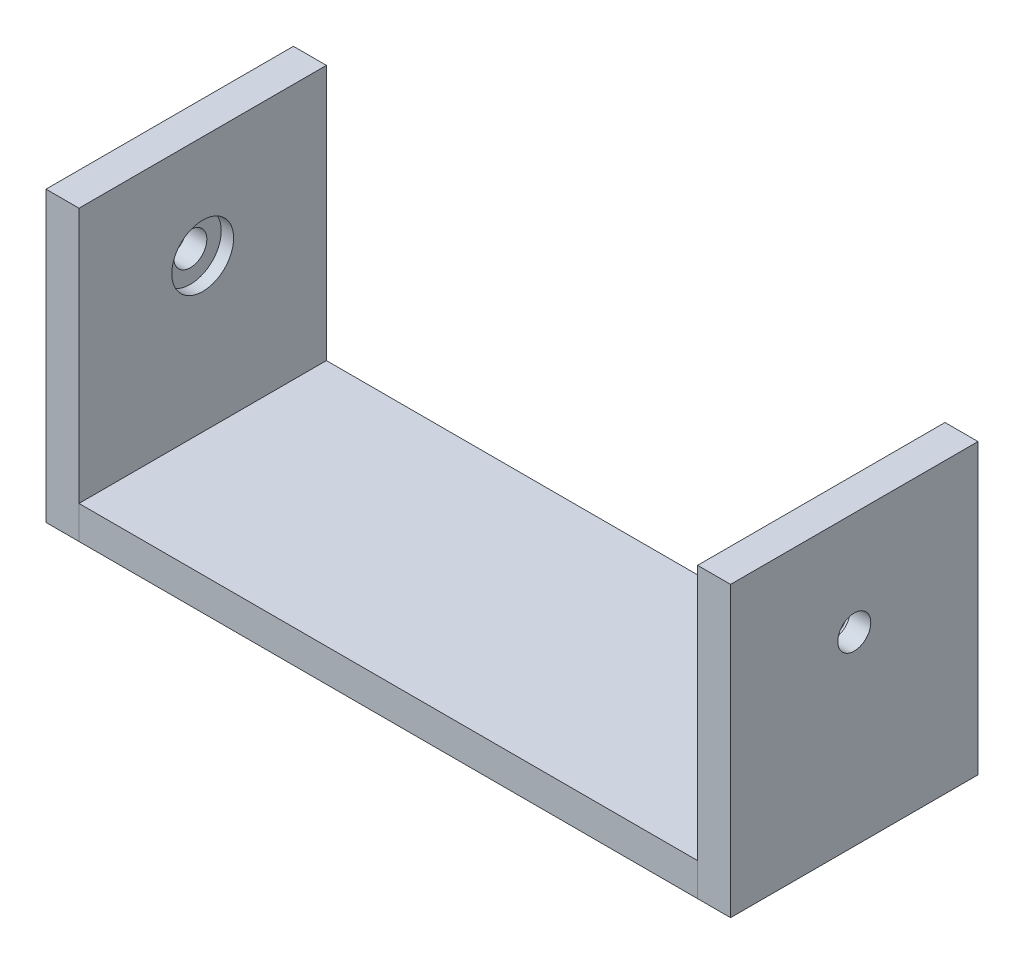
ISO-10303-21;
HEADER;
FILE_DESCRIPTION(('STEP AP214'),'2;1');
FILE_NAME('part.step','',(''),(''),'','','');
FILE_SCHEMA(('AUTOMOTIVE_DESIGN { 1 0 10303 214 1 1 1 1 }'));
ENDSEC;
DATA;
#1=APPLICATION_CONTEXT('core data for automotive mechanical design processes');
#2=APPLICATION_PROTOCOL_DEFINITION('international standard','automotive_design',2000,#1);
#3=PRODUCT_CONTEXT('',#1,'mechanical');
#4=PRODUCT('Part','Part','',(#3));
#5=PRODUCT_RELATED_PRODUCT_CATEGORY('part','',(#4));
#6=PRODUCT_DEFINITION_FORMATION('','',#4);
#7=PRODUCT_DEFINITION_CONTEXT('part definition',#1,'design');
#8=PRODUCT_DEFINITION('design','',#6,#7);
#9=PRODUCT_DEFINITION_SHAPE('','',#8);
#10=(LENGTH_UNIT() NAMED_UNIT(*) SI_UNIT(.MILLI.,.METRE.));
#11=(NAMED_UNIT(*) PLANE_ANGLE_UNIT() SI_UNIT($,.RADIAN.));
#12=(NAMED_UNIT(*) SI_UNIT($,.STERADIAN.) SOLID_ANGLE_UNIT());
#13=UNCERTAINTY_MEASURE_WITH_UNIT(LENGTH_MEASURE(1.E-05),#10,'distance_accuracy_value','');
#14=(GEOMETRIC_REPRESENTATION_CONTEXT(3) GLOBAL_UNCERTAINTY_ASSIGNED_CONTEXT((#13)) GLOBAL_UNIT_ASSIGNED_CONTEXT((#10,
#11,#12)) REPRESENTATION_CONTEXT('',''));
#15=CARTESIAN_POINT('',(0.,0.,0.));
#16=DIRECTION('',(0.,0.,1.));
#17=DIRECTION('',(1.,0.,0.));
#18=AXIS2_PLACEMENT_3D('',#15,#16,#17);
#19=CARTESIAN_POINT('',(-83.,41.,30.));
#20=DIRECTION('',(1.,0.,0.));
#21=DIRECTION('',(0.,0.,-1.));
#22=AXIS2_PLACEMENT_3D('',#19,#20,#21);
#23=CYLINDRICAL_SURFACE('',#22,4.);
#24=CARTESIAN_POINT('',(-83.,41.,30.));
#25=DIRECTION('',(1.,0.,0.));
#26=DIRECTION('',(0.,0.,-1.));
#27=AXIS2_PLACEMENT_3D('',#24,#25,#26);
#28=CIRCLE('',#27,4.);
#29=CARTESIAN_POINT('',(-83.,41.,26.));
#30=VERTEX_POINT('',#29);
#31=EDGE_CURVE('E112',#30,#30,#28,.T.);
#32=CARTESIAN_POINT('',(-78.,41.,30.));
#33=DIRECTION('',(1.,0.,0.));
#34=DIRECTION('',(0.,0.,-1.));
#35=AXIS2_PLACEMENT_3D('',#32,#33,#34);
#36=CIRCLE('',#35,4.);
#37=CARTESIAN_POINT('',(-78.,41.,26.));
#38=VERTEX_POINT('',#37);
#39=EDGE_CURVE('E47',#38,#38,#36,.F.);
#40=CARTESIAN_POINT('',(-83.,41.,26.));
#41=CARTESIAN_POINT('',(-82.9479166666667,41.,26.));
#42=CARTESIAN_POINT('',(-82.8958333333333,41.,26.));
#43=CARTESIAN_POINT('',(-82.7916666666667,41.,26.));
#44=CARTESIAN_POINT('',(-82.7395833333333,41.,26.));
#45=CARTESIAN_POINT('',(-82.6354166666667,41.,26.));
#46=CARTESIAN_POINT('',(-82.5833333333333,41.,26.));
#47=CARTESIAN_POINT('',(-82.4791666666667,41.,26.));
#48=CARTESIAN_POINT('',(-82.4270833333333,41.,26.));
#49=CARTESIAN_POINT('',(-82.3229166666667,41.,26.));
#50=CARTESIAN_POINT('',(-82.2708333333333,41.,26.));
#51=CARTESIAN_POINT('',(-82.1666666666667,41.,26.));
#52=CARTESIAN_POINT('',(-82.1145833333333,41.,26.));
#53=CARTESIAN_POINT('',(-82.0104166666667,41.,26.));
#54=CARTESIAN_POINT('',(-81.9583333333333,41.,26.));
#55=CARTESIAN_POINT('',(-81.8541666666667,41.,26.));
#56=CARTESIAN_POINT('',(-81.8020833333333,41.,26.));
#57=CARTESIAN_POINT('',(-81.6979166666667,41.,26.));
#58=CARTESIAN_POINT('',(-81.6458333333333,41.,26.));
#59=CARTESIAN_POINT('',(-81.5416666666667,41.,26.));
#60=CARTESIAN_POINT('',(-81.4895833333333,41.,26.));
#61=CARTESIAN_POINT('',(-81.3854166666667,41.,26.));
#62=CARTESIAN_POINT('',(-81.3333333333333,41.,26.));
#63=CARTESIAN_POINT('',(-81.2291666666667,41.,26.));
#64=CARTESIAN_POINT('',(-81.1770833333333,41.,26.));
#65=CARTESIAN_POINT('',(-81.0729166666667,41.,26.));
#66=CARTESIAN_POINT('',(-81.0208333333333,41.,26.));
#67=CARTESIAN_POINT('',(-80.9166666666667,41.,26.));
#68=CARTESIAN_POINT('',(-80.8645833333333,41.,26.));
#69=CARTESIAN_POINT('',(-80.7604166666667,41.,26.));
#70=CARTESIAN_POINT('',(-80.7083333333333,41.,26.));
#71=CARTESIAN_POINT('',(-80.6041666666667,41.,26.));
#72=CARTESIAN_POINT('',(-80.5520833333333,41.,26.));
#73=CARTESIAN_POINT('',(-80.4479166666667,41.,26.));
#74=CARTESIAN_POINT('',(-80.3958333333333,41.,26.));
#75=CARTESIAN_POINT('',(-80.2916666666667,41.,26.));
#76=CARTESIAN_POINT('',(-80.2395833333333,41.,26.));
#77=CARTESIAN_POINT('',(-80.1354166666667,41.,26.));
#78=CARTESIAN_POINT('',(-80.0833333333333,41.,26.));
#79=CARTESIAN_POINT('',(-79.9791666666667,41.,26.));
#80=CARTESIAN_POINT('',(-79.9270833333333,41.,26.));
#81=CARTESIAN_POINT('',(-79.8229166666667,41.,26.));
#82=CARTESIAN_POINT('',(-79.7708333333333,41.,26.));
#83=CARTESIAN_POINT('',(-79.6666666666667,41.,26.));
#84=CARTESIAN_POINT('',(-79.6145833333333,41.,26.));
#85=CARTESIAN_POINT('',(-79.5104166666667,41.,26.));
#86=CARTESIAN_POINT('',(-79.4583333333333,41.,26.));
#87=CARTESIAN_POINT('',(-79.3541666666667,41.,26.));
#88=CARTESIAN_POINT('',(-79.3020833333333,41.,26.));
#89=CARTESIAN_POINT('',(-79.1979166666667,41.,26.));
#90=CARTESIAN_POINT('',(-79.1458333333333,41.,26.));
#91=CARTESIAN_POINT('',(-79.0416666666667,41.,26.));
#92=CARTESIAN_POINT('',(-78.9895833333333,41.,26.));
#93=CARTESIAN_POINT('',(-78.8854166666667,41.,26.));
#94=CARTESIAN_POINT('',(-78.8333333333333,41.,26.));
#95=CARTESIAN_POINT('',(-78.7291666666667,41.,26.));
#96=CARTESIAN_POINT('',(-78.6770833333333,41.,26.));
#97=CARTESIAN_POINT('',(-78.5729166666667,41.,26.));
#98=CARTESIAN_POINT('',(-78.5208333333333,41.,26.));
#99=CARTESIAN_POINT('',(-78.4166666666667,41.,26.));
#100=CARTESIAN_POINT('',(-78.3645833333333,41.,26.));
#101=CARTESIAN_POINT('',(-78.2604166666667,41.,26.));
#102=CARTESIAN_POINT('',(-78.2083333333333,41.,26.));
#103=CARTESIAN_POINT('',(-78.1041666666667,41.,26.));
#104=CARTESIAN_POINT('',(-78.0520833333333,41.,26.));
#105=CARTESIAN_POINT('',(-78.,41.,26.));
#106=B_SPLINE_CURVE_WITH_KNOTS('',3,(#40,#41,#42,#43,#44,#45,#46,#47,#48,#49,#50,#51,#52,#53,
#54,#55,#56,#57,#58,#59,#60,#61,#62,#63,#64,#65,#66,#67,#68,#69,#70,#71,#72,#73,#74,#75,#76,#77,
#78,#79,#80,#81,#82,#83,#84,#85,#86,#87,#88,#89,#90,#91,#92,#93,#94,#95,#96,#97,#98,#99,#100,
#101,#102,#103,#104,#105),.UNSPECIFIED.,.F.,.F.,(4,2,2,2,2,2,2,2,2,2,2,2,2,2,2,2,2,2,2,2,2,2,2,
2,2,2,2,2,2,2,2,2,4),(0.,0.156249999999997,0.312499999999993,0.46874999999999,0.624999999999987,
0.781249999999997,0.937499999999994,1.09374999999999,1.24999999999999,1.40624999999998,
1.56249999999999,1.71874999999999,1.87499999999999,2.03124999999998,2.1875,2.34374999999999,
2.49999999999999,2.65624999999998,2.81249999999998,2.96874999999999,3.12499999999999,
3.28124999999999,3.43749999999998,3.59374999999999,3.74999999999999,3.90624999999999,
4.06249999999998,4.21874999999998,4.37499999999999,4.53124999999999,4.68749999999998,
4.84374999999998,4.99999999999999),.UNSPECIFIED.);
#107=EDGE_CURVE('BSEAM43',#30,#38,#106,.T.);
#108=ORIENTED_EDGE('',*,*,#31,.F.);
#109=ORIENTED_EDGE('',*,*,#39,.F.);
#110=ORIENTED_EDGE('',*,*,#107,.T.);
#111=ORIENTED_EDGE('',*,*,#107,.F.);
#112=EDGE_LOOP('',(#108,#110,#109,#111));
#113=FACE_BOUND('',#112,.T.);
#114=ADVANCED_FACE('F43',(#113),#23,.F.);
#115=CARTESIAN_POINT('',(-83.,66.,60.));
#116=DIRECTION('',(0.,-1.,0.));
#117=DIRECTION('',(0.,0.,-1.));
#118=AXIS2_PLACEMENT_3D('',#115,#116,#117);
#119=PLANE('',#118);
#120=DIRECTION('',(0.,0.,-1.));
#121=VECTOR('',#120,1.);
#122=CARTESIAN_POINT('',(-75.,66.,60.));
#123=LINE('',#122,#121);
#124=CARTESIAN_POINT('',(-75.,66.,60.));
#125=VERTEX_POINT('',#124);
#126=CARTESIAN_POINT('',(-75.,66.,0.));
#127=VERTEX_POINT('',#126);
#128=EDGE_CURVE('E109',#125,#127,#123,.T.);
#129=ORIENTED_EDGE('',*,*,#128,.T.);
#130=DIRECTION('',(1.,0.,0.));
#131=VECTOR('',#130,1.);
#132=CARTESIAN_POINT('',(-83.,66.,0.));
#133=LINE('',#132,#131);
#134=CARTESIAN_POINT('',(-83.,66.,0.));
#135=VERTEX_POINT('',#134);
#136=EDGE_CURVE('E12',#135,#127,#133,.T.);
#137=ORIENTED_EDGE('',*,*,#136,.F.);
#138=DIRECTION('',(0.,0.,-1.));
#139=VECTOR('',#138,1.);
#140=CARTESIAN_POINT('',(-83.,66.,60.));
#141=LINE('',#140,#139);
#142=CARTESIAN_POINT('',(-83.,66.,60.));
#143=VERTEX_POINT('',#142);
#144=EDGE_CURVE('E96',#143,#135,#141,.T.);
#145=ORIENTED_EDGE('',*,*,#144,.F.);
#146=DIRECTION('',(1.,0.,0.));
#147=VECTOR('',#146,1.);
#148=CARTESIAN_POINT('',(-83.,66.,60.));
#149=LINE('',#148,#147);
#150=EDGE_CURVE('E105',#143,#125,#149,.T.);
#151=ORIENTED_EDGE('',*,*,#150,.T.);
#152=EDGE_LOOP('',(#129,#137,#145,#151));
#153=FACE_BOUND('',#152,.T.);
#154=ADVANCED_FACE('F45',(#153),#119,.F.);
#155=CARTESIAN_POINT('',(-83.,66.,0.));
#156=DIRECTION('',(0.,0.,1.));
#157=DIRECTION('',(1.,0.,0.));
#158=AXIS2_PLACEMENT_3D('',#155,#156,#157);
#159=PLANE('',#158);
#160=DIRECTION('',(0.,-1.,0.));
#161=VECTOR('',#160,1.);
#162=CARTESIAN_POINT('',(-75.,66.,0.));
#163=LINE('',#162,#161);
#164=CARTESIAN_POINT('',(-75.,-4.,0.));
#165=VERTEX_POINT('',#164);
#166=EDGE_CURVE('E100',#127,#165,#163,.T.);
#167=ORIENTED_EDGE('',*,*,#166,.T.);
#168=DIRECTION('',(1.,0.,0.));
#169=VECTOR('',#168,1.);
#170=CARTESIAN_POINT('',(-83.,-4.,0.));
#171=LINE('',#170,#169);
#172=CARTESIAN_POINT('',(-83.,-4.,0.));
#173=VERTEX_POINT('',#172);
#174=EDGE_CURVE('E53',#173,#165,#171,.T.);
#175=ORIENTED_EDGE('',*,*,#174,.F.);
#176=DIRECTION('',(0.,-1.,0.));
#177=VECTOR('',#176,1.);
#178=CARTESIAN_POINT('',(-83.,66.,0.));
#179=LINE('',#178,#177);
#180=EDGE_CURVE('E91',#135,#173,#179,.T.);
#181=ORIENTED_EDGE('',*,*,#180,.F.);
#182=ORIENTED_EDGE('',*,*,#136,.T.);
#183=EDGE_LOOP('',(#167,#175,#181,#182));
#184=FACE_BOUND('',#183,.T.);
#185=ADVANCED_FACE('F99',(#184),#159,.F.);
#186=CARTESIAN_POINT('',(-83.,-4.,0.));
#187=DIRECTION('',(0.,1.,0.));
#188=DIRECTION('',(0.,0.,1.));
#189=AXIS2_PLACEMENT_3D('',#186,#187,#188);
#190=PLANE('',#189);
#191=DIRECTION('',(0.,0.,1.));
#192=VECTOR('',#191,1.);
#193=CARTESIAN_POINT('',(-75.,-4.,0.));
#194=LINE('',#193,#192);
#195=CARTESIAN_POINT('',(-75.,-4.,60.));
#196=VERTEX_POINT('',#195);
#197=EDGE_CURVE('E78',#165,#196,#194,.T.);
#198=ORIENTED_EDGE('',*,*,#197,.T.);
#199=DIRECTION('',(1.,0.,0.));
#200=VECTOR('',#199,1.);
#201=CARTESIAN_POINT('',(-83.,-4.,60.));
#202=LINE('',#201,#200);
#203=CARTESIAN_POINT('',(-83.,-4.,60.));
#204=VERTEX_POINT('',#203);
#205=EDGE_CURVE('E101',#204,#196,#202,.T.);
#206=ORIENTED_EDGE('',*,*,#205,.F.);
#207=DIRECTION('',(0.,0.,1.));
#208=VECTOR('',#207,1.);
#209=CARTESIAN_POINT('',(-83.,-4.,0.));
#210=LINE('',#209,#208);
#211=EDGE_CURVE('E94',#173,#204,#210,.T.);
#212=ORIENTED_EDGE('',*,*,#211,.F.);
#213=ORIENTED_EDGE('',*,*,#174,.T.);
#214=EDGE_LOOP('',(#198,#206,#212,#213));
#215=FACE_BOUND('',#214,.T.);
#216=ADVANCED_FACE('F103',(#215),#190,.F.);
#217=CARTESIAN_POINT('',(-83.,-4.,60.));
#218=DIRECTION('',(0.,0.,-1.));
#219=DIRECTION('',(-1.,0.,0.));
#220=AXIS2_PLACEMENT_3D('',#217,#218,#219);
#221=PLANE('',#220);
#222=DIRECTION('',(0.,1.,0.));
#223=VECTOR('',#222,1.);
#224=CARTESIAN_POINT('',(-75.,-4.,60.));
#225=LINE('',#224,#223);
#226=EDGE_CURVE('E84',#196,#125,#225,.T.);
#227=ORIENTED_EDGE('',*,*,#226,.T.);
#228=ORIENTED_EDGE('',*,*,#150,.F.);
#229=DIRECTION('',(0.,1.,0.));
#230=VECTOR('',#229,1.);
#231=CARTESIAN_POINT('',(-83.,-4.,60.));
#232=LINE('',#231,#230);
#233=EDGE_CURVE('E61',#204,#143,#232,.T.);
#234=ORIENTED_EDGE('',*,*,#233,.F.);
#235=ORIENTED_EDGE('',*,*,#205,.T.);
#236=EDGE_LOOP('',(#227,#228,#234,#235));
#237=FACE_BOUND('',#236,.T.);
#238=ADVANCED_FACE('F117',(#237),#221,.F.);
#239=CARTESIAN_POINT('',(-83.,0.,0.));
#240=DIRECTION('',(-1.,0.,0.));
#241=DIRECTION('',(0.,0.,1.));
#242=AXIS2_PLACEMENT_3D('',#239,#240,#241);
#243=PLANE('',#242);
#244=ORIENTED_EDGE('',*,*,#31,.T.);
#245=EDGE_LOOP('',(#244));
#246=FACE_BOUND('',#245,.T.);
#247=ORIENTED_EDGE('',*,*,#144,.T.);
#248=ORIENTED_EDGE('',*,*,#180,.T.);
#249=ORIENTED_EDGE('',*,*,#211,.T.);
#250=ORIENTED_EDGE('',*,*,#233,.T.);
#251=EDGE_LOOP('',(#247,#248,#249,#250));
#252=FACE_BOUND('',#251,.T.);
#253=ADVANCED_FACE('F92',(#246,#252),#243,.T.);
#254=CARTESIAN_POINT('',(-75.,0.,0.));
#255=DIRECTION('',(-1.,0.,0.));
#256=DIRECTION('',(0.,0.,1.));
#257=AXIS2_PLACEMENT_3D('',#254,#255,#256);
#258=PLANE('',#257);
#259=CARTESIAN_POINT('',(-75.,41.,30.));
#260=DIRECTION('',(1.,0.,0.));
#261=DIRECTION('',(0.,0.,-1.));
#262=AXIS2_PLACEMENT_3D('',#259,#260,#261);
#263=CIRCLE('',#262,7.5);
#264=CARTESIAN_POINT('',(-75.,41.,22.5));
#265=VERTEX_POINT('',#264);
#266=EDGE_CURVE('E125',#265,#265,#263,.T.);
#267=ORIENTED_EDGE('',*,*,#266,.F.);
#268=EDGE_LOOP('',(#267));
#269=FACE_BOUND('',#268,.T.);
#270=ORIENTED_EDGE('',*,*,#128,.F.);
#271=ORIENTED_EDGE('',*,*,#226,.F.);
#272=ORIENTED_EDGE('',*,*,#197,.F.);
#273=ORIENTED_EDGE('',*,*,#166,.F.);
#274=EDGE_LOOP('',(#270,#271,#272,#273));
#275=FACE_BOUND('',#274,.T.);
#276=ADVANCED_FACE('F120',(#269,#275),#258,.F.);
#277=CARTESIAN_POINT('',(-78.,41.,30.));
#278=DIRECTION('',(1.,0.,0.));
#279=DIRECTION('',(0.,0.,-1.));
#280=AXIS2_PLACEMENT_3D('',#277,#278,#279);
#281=PLANE('',#280);
#282=CARTESIAN_POINT('',(-78.,41.,30.));
#283=DIRECTION('',(1.,0.,0.));
#284=DIRECTION('',(0.,0.,-1.));
#285=AXIS2_PLACEMENT_3D('',#282,#283,#284);
#286=CIRCLE('',#285,7.5);
#287=CARTESIAN_POINT('',(-78.,41.,22.5));
#288=VERTEX_POINT('',#287);
#289=EDGE_CURVE('E128',#288,#288,#286,.T.);
#290=ORIENTED_EDGE('',*,*,#289,.T.);
#291=EDGE_LOOP('',(#290));
#292=FACE_BOUND('',#291,.T.);
#293=ORIENTED_EDGE('',*,*,#39,.T.);
#294=EDGE_LOOP('',(#293));
#295=FACE_BOUND('',#294,.T.);
#296=ADVANCED_FACE('F135',(#292,#295),#281,.T.);
#297=CARTESIAN_POINT('',(-78.,41.,30.));
#298=DIRECTION('',(1.,0.,0.));
#299=DIRECTION('',(0.,0.,-1.));
#300=AXIS2_PLACEMENT_3D('',#297,#298,#299);
#301=CYLINDRICAL_SURFACE('',#300,7.5);
#302=ORIENTED_EDGE('',*,*,#289,.F.);
#303=EDGE_LOOP('',(#302));
#304=FACE_BOUND('',#303,.T.);
#305=ORIENTED_EDGE('',*,*,#266,.T.);
#306=EDGE_LOOP('',(#305));
#307=FACE_BOUND('',#306,.T.);
#308=ADVANCED_FACE('F146',(#304,#307),#301,.F.);
#309=CLOSED_SHELL('',(#114,#154,#185,#216,#238,#253,#276,#296,#308));
#310=MANIFOLD_SOLID_BREP('B2',#309);
#311=CARTESIAN_POINT('',(-83.,41.,30.));
#312=DIRECTION('',(1.,0.,0.));
#313=DIRECTION('',(0.,0.,-1.));
#314=AXIS2_PLACEMENT_3D('',#311,#312,#313);
#315=CYLINDRICAL_SURFACE('',#314,4.);
#316=CARTESIAN_POINT('',(83.,41.,30.));
#317=DIRECTION('',(1.,0.,0.));
#318=DIRECTION('',(0.,0.,-1.));
#319=AXIS2_PLACEMENT_3D('',#316,#317,#318);
#320=CIRCLE('',#319,4.);
#321=CARTESIAN_POINT('',(83.,41.,26.));
#322=VERTEX_POINT('',#321);
#323=EDGE_CURVE('E295',#322,#322,#320,.T.);
#324=CARTESIAN_POINT('',(78.,41.,30.));
#325=DIRECTION('',(-1.,0.,0.));
#326=DIRECTION('',(0.,0.,1.));
#327=AXIS2_PLACEMENT_3D('',#324,#325,#326);
#328=CIRCLE('',#327,4.);
#329=CARTESIAN_POINT('',(78.,41.,26.));
#330=VERTEX_POINT('',#329);
#331=EDGE_CURVE('E230',#330,#330,#328,.F.);
#332=CARTESIAN_POINT('',(83.,41.,26.));
#333=CARTESIAN_POINT('',(82.9479166666666,41.,26.));
#334=CARTESIAN_POINT('',(82.8958333333333,41.,26.));
#335=CARTESIAN_POINT('',(82.7916666666666,41.,26.));
#336=CARTESIAN_POINT('',(82.7395833333333,41.,26.));
#337=CARTESIAN_POINT('',(82.6354166666666,41.,26.));
#338=CARTESIAN_POINT('',(82.5833333333333,41.,26.));
#339=CARTESIAN_POINT('',(82.4791666666666,41.,26.));
#340=CARTESIAN_POINT('',(82.4270833333333,41.,26.));
#341=CARTESIAN_POINT('',(82.3229166666666,41.,26.));
#342=CARTESIAN_POINT('',(82.2708333333333,41.,26.));
#343=CARTESIAN_POINT('',(82.1666666666667,41.,26.));
#344=CARTESIAN_POINT('',(82.1145833333333,41.,26.));
#345=CARTESIAN_POINT('',(82.0104166666667,41.,26.));
#346=CARTESIAN_POINT('',(81.9583333333333,41.,26.));
#347=CARTESIAN_POINT('',(81.8541666666667,41.,26.));
#348=CARTESIAN_POINT('',(81.8020833333333,41.,26.));
#349=CARTESIAN_POINT('',(81.6979166666666,41.,26.));
#350=CARTESIAN_POINT('',(81.6458333333333,41.,26.));
#351=CARTESIAN_POINT('',(81.5416666666666,41.,26.));
#352=CARTESIAN_POINT('',(81.4895833333333,41.,26.));
#353=CARTESIAN_POINT('',(81.3854166666666,41.,26.));
#354=CARTESIAN_POINT('',(81.3333333333333,41.,26.));
#355=CARTESIAN_POINT('',(81.2291666666666,41.,26.));
#356=CARTESIAN_POINT('',(81.1770833333333,41.,26.));
#357=CARTESIAN_POINT('',(81.0729166666666,41.,26.));
#358=CARTESIAN_POINT('',(81.0208333333333,41.,26.));
#359=CARTESIAN_POINT('',(80.9166666666667,41.,26.));
#360=CARTESIAN_POINT('',(80.8645833333333,41.,26.));
#361=CARTESIAN_POINT('',(80.7604166666667,41.,26.));
#362=CARTESIAN_POINT('',(80.7083333333333,41.,26.));
#363=CARTESIAN_POINT('',(80.6041666666667,41.,26.));
#364=CARTESIAN_POINT('',(80.5520833333333,41.,26.));
#365=CARTESIAN_POINT('',(80.4479166666667,41.,26.));
#366=CARTESIAN_POINT('',(80.3958333333333,41.,26.));
#367=CARTESIAN_POINT('',(80.2916666666667,41.,26.));
#368=CARTESIAN_POINT('',(80.2395833333333,41.,26.));
#369=CARTESIAN_POINT('',(80.1354166666667,41.,26.));
#370=CARTESIAN_POINT('',(80.0833333333333,41.,26.));
#371=CARTESIAN_POINT('',(79.9791666666667,41.,26.));
#372=CARTESIAN_POINT('',(79.9270833333333,41.,26.));
#373=CARTESIAN_POINT('',(79.8229166666667,41.,26.));
#374=CARTESIAN_POINT('',(79.7708333333333,41.,26.));
#375=CARTESIAN_POINT('',(79.6666666666667,41.,26.));
#376=CARTESIAN_POINT('',(79.6145833333333,41.,26.));
#377=CARTESIAN_POINT('',(79.5104166666667,41.,26.));
#378=CARTESIAN_POINT('',(79.4583333333333,41.,26.));
#379=CARTESIAN_POINT('',(79.3541666666667,41.,26.));
#380=CARTESIAN_POINT('',(79.3020833333333,41.,26.));
#381=CARTESIAN_POINT('',(79.1979166666667,41.,26.));
#382=CARTESIAN_POINT('',(79.1458333333333,41.,26.));
#383=CARTESIAN_POINT('',(79.0416666666667,41.,26.));
#384=CARTESIAN_POINT('',(78.9895833333333,41.,26.));
#385=CARTESIAN_POINT('',(78.8854166666667,41.,26.));
#386=CARTESIAN_POINT('',(78.8333333333333,41.,26.));
#387=CARTESIAN_POINT('',(78.7291666666667,41.,26.));
#388=CARTESIAN_POINT('',(78.6770833333333,41.,26.));
#389=CARTESIAN_POINT('',(78.5729166666667,41.,26.));
#390=CARTESIAN_POINT('',(78.5208333333333,41.,26.));
#391=CARTESIAN_POINT('',(78.4166666666667,41.,26.));
#392=CARTESIAN_POINT('',(78.3645833333333,41.,26.));
#393=CARTESIAN_POINT('',(78.2604166666667,41.,26.));
#394=CARTESIAN_POINT('',(78.2083333333333,41.,26.));
#395=CARTESIAN_POINT('',(78.1041666666667,41.,26.));
#396=CARTESIAN_POINT('',(78.0520833333333,41.,26.));
#397=CARTESIAN_POINT('',(78.,41.,26.));
#398=B_SPLINE_CURVE_WITH_KNOTS('',3,(#332,#333,#334,#335,#336,#337,#338,#339,#340,#341,#342,
#343,#344,#345,#346,#347,#348,#349,#350,#351,#352,#353,#354,#355,#356,#357,#358,#359,#360,#361,
#362,#363,#364,#365,#366,#367,#368,#369,#370,#371,#372,#373,#374,#375,#376,#377,#378,#379,#380,
#381,#382,#383,#384,#385,#386,#387,#388,#389,#390,#391,#392,#393,#394,#395,#396,#397),
.UNSPECIFIED.,.F.,.F.,(4,2,2,2,2,2,2,2,2,2,2,2,2,2,2,2,2,2,2,2,2,2,2,2,2,2,2,2,2,2,2,2,4),(0.,
0.156249999999997,0.312499999999993,0.46874999999999,0.624999999999987,0.781249999999983,
0.93749999999998,1.09374999999998,1.24999999999997,1.40625,1.56249999999999,1.71874999999999,
1.87499999999999,2.03124999999998,2.18749999999998,2.34374999999998,2.49999999999997,
2.65624999999997,2.81249999999997,2.96874999999996,3.12499999999996,3.28124999999996,
3.43749999999995,3.59374999999995,3.74999999999998,3.90624999999997,4.06249999999997,
4.21874999999997,4.37499999999996,4.53124999999996,4.68749999999996,4.84374999999995,
4.99999999999995),.UNSPECIFIED.);
#399=EDGE_CURVE('BSEAM226',#322,#330,#398,.T.);
#400=ORIENTED_EDGE('',*,*,#323,.T.);
#401=ORIENTED_EDGE('',*,*,#331,.F.);
#402=ORIENTED_EDGE('',*,*,#399,.T.);
#403=ORIENTED_EDGE('',*,*,#399,.F.);
#404=EDGE_LOOP('',(#400,#402,#401,#403));
#405=FACE_BOUND('',#404,.T.);
#406=ADVANCED_FACE('F226',(#405),#315,.F.);
#407=CARTESIAN_POINT('',(83.,-4.,60.));
#408=DIRECTION('',(0.,0.,-1.));
#409=DIRECTION('',(-1.,0.,0.));
#410=AXIS2_PLACEMENT_3D('',#407,#408,#409);
#411=PLANE('',#410);
#412=DIRECTION('',(0.,-1.,0.));
#413=VECTOR('',#412,1.);
#414=CARTESIAN_POINT('',(75.,-4.,60.));
#415=LINE('',#414,#413);
#416=CARTESIAN_POINT('',(75.,66.,60.));
#417=VERTEX_POINT('',#416);
#418=CARTESIAN_POINT('',(75.,-4.,60.));
#419=VERTEX_POINT('',#418);
#420=EDGE_CURVE('E292',#417,#419,#415,.T.);
#421=ORIENTED_EDGE('',*,*,#420,.T.);
#422=DIRECTION('',(-1.,0.,0.));
#423=VECTOR('',#422,1.);
#424=CARTESIAN_POINT('',(83.,-4.,60.));
#425=LINE('',#424,#423);
#426=CARTESIAN_POINT('',(83.,-4.,60.));
#427=VERTEX_POINT('',#426);
#428=EDGE_CURVE('E41',#427,#419,#425,.T.);
#429=ORIENTED_EDGE('',*,*,#428,.F.);
#430=DIRECTION('',(0.,-1.,0.));
#431=VECTOR('',#430,1.);
#432=CARTESIAN_POINT('',(83.,-4.,60.));
#433=LINE('',#432,#431);
#434=CARTESIAN_POINT('',(83.,66.,60.));
#435=VERTEX_POINT('',#434);
#436=EDGE_CURVE('E279',#435,#427,#433,.T.);
#437=ORIENTED_EDGE('',*,*,#436,.F.);
#438=DIRECTION('',(-1.,0.,0.));
#439=VECTOR('',#438,1.);
#440=CARTESIAN_POINT('',(83.,66.,60.));
#441=LINE('',#440,#439);
#442=EDGE_CURVE('E288',#435,#417,#441,.T.);
#443=ORIENTED_EDGE('',*,*,#442,.T.);
#444=EDGE_LOOP('',(#421,#429,#437,#443));
#445=FACE_BOUND('',#444,.T.);
#446=ADVANCED_FACE('F228',(#445),#411,.F.);
#447=CARTESIAN_POINT('',(83.,-4.,60.));
#448=DIRECTION('',(0.,1.,0.));
#449=DIRECTION('',(0.,0.,1.));
#450=AXIS2_PLACEMENT_3D('',#447,#448,#449);
#451=PLANE('',#450);
#452=DIRECTION('',(0.,0.,-1.));
#453=VECTOR('',#452,1.);
#454=CARTESIAN_POINT('',(75.,-4.,60.));
#455=LINE('',#454,#453);
#456=CARTESIAN_POINT('',(75.,-4.,0.));
#457=VERTEX_POINT('',#456);
#458=EDGE_CURVE('E283',#419,#457,#455,.T.);
#459=ORIENTED_EDGE('',*,*,#458,.T.);
#460=DIRECTION('',(-1.,0.,0.));
#461=VECTOR('',#460,1.);
#462=CARTESIAN_POINT('',(83.,-4.,0.));
#463=LINE('',#462,#461);
#464=CARTESIAN_POINT('',(83.,-4.,0.));
#465=VERTEX_POINT('',#464);
#466=EDGE_CURVE('E236',#465,#457,#463,.T.);
#467=ORIENTED_EDGE('',*,*,#466,.F.);
#468=DIRECTION('',(0.,0.,-1.));
#469=VECTOR('',#468,1.);
#470=CARTESIAN_POINT('',(83.,-4.,60.));
#471=LINE('',#470,#469);
#472=EDGE_CURVE('E274',#427,#465,#471,.T.);
#473=ORIENTED_EDGE('',*,*,#472,.F.);
#474=ORIENTED_EDGE('',*,*,#428,.T.);
#475=EDGE_LOOP('',(#459,#467,#473,#474));
#476=FACE_BOUND('',#475,.T.);
#477=ADVANCED_FACE('F282',(#476),#451,.F.);
#478=CARTESIAN_POINT('',(83.,-4.,0.));
#479=DIRECTION('',(0.,0.,1.));
#480=DIRECTION('',(1.,0.,0.));
#481=AXIS2_PLACEMENT_3D('',#478,#479,#480);
#482=PLANE('',#481);
#483=DIRECTION('',(0.,1.,0.));
#484=VECTOR('',#483,1.);
#485=CARTESIAN_POINT('',(75.,-4.,0.));
#486=LINE('',#485,#484);
#487=CARTESIAN_POINT('',(75.,66.,0.));
#488=VERTEX_POINT('',#487);
#489=EDGE_CURVE('E261',#457,#488,#486,.T.);
#490=ORIENTED_EDGE('',*,*,#489,.T.);
#491=DIRECTION('',(-1.,0.,0.));
#492=VECTOR('',#491,1.);
#493=CARTESIAN_POINT('',(83.,66.,0.));
#494=LINE('',#493,#492);
#495=CARTESIAN_POINT('',(83.,66.,0.));
#496=VERTEX_POINT('',#495);
#497=EDGE_CURVE('E284',#496,#488,#494,.T.);
#498=ORIENTED_EDGE('',*,*,#497,.F.);
#499=DIRECTION('',(0.,1.,0.));
#500=VECTOR('',#499,1.);
#501=CARTESIAN_POINT('',(83.,-4.,0.));
#502=LINE('',#501,#500);
#503=EDGE_CURVE('E277',#465,#496,#502,.T.);
#504=ORIENTED_EDGE('',*,*,#503,.F.);
#505=ORIENTED_EDGE('',*,*,#466,.T.);
#506=EDGE_LOOP('',(#490,#498,#504,#505));
#507=FACE_BOUND('',#506,.T.);
#508=ADVANCED_FACE('F286',(#507),#482,.F.);
#509=CARTESIAN_POINT('',(83.,66.,60.));
#510=DIRECTION('',(0.,-1.,0.));
#511=DIRECTION('',(0.,0.,-1.));
#512=AXIS2_PLACEMENT_3D('',#509,#510,#511);
#513=PLANE('',#512);
#514=DIRECTION('',(0.,0.,1.));
#515=VECTOR('',#514,1.);
#516=CARTESIAN_POINT('',(75.,66.,60.));
#517=LINE('',#516,#515);
#518=EDGE_CURVE('E267',#488,#417,#517,.T.);
#519=ORIENTED_EDGE('',*,*,#518,.T.);
#520=ORIENTED_EDGE('',*,*,#442,.F.);
#521=DIRECTION('',(0.,0.,1.));
#522=VECTOR('',#521,1.);
#523=CARTESIAN_POINT('',(83.,66.,60.));
#524=LINE('',#523,#522);
#525=EDGE_CURVE('E244',#496,#435,#524,.T.);
#526=ORIENTED_EDGE('',*,*,#525,.F.);
#527=ORIENTED_EDGE('',*,*,#497,.T.);
#528=EDGE_LOOP('',(#519,#520,#526,#527));
#529=FACE_BOUND('',#528,.T.);
#530=ADVANCED_FACE('F300',(#529),#513,.F.);
#531=CARTESIAN_POINT('',(83.,0.,0.));
#532=DIRECTION('',(-1.,0.,0.));
#533=DIRECTION('',(0.,0.,1.));
#534=AXIS2_PLACEMENT_3D('',#531,#532,#533);
#535=PLANE('',#534);
#536=ORIENTED_EDGE('',*,*,#323,.F.);
#537=EDGE_LOOP('',(#536));
#538=FACE_BOUND('',#537,.T.);
#539=ORIENTED_EDGE('',*,*,#436,.T.);
#540=ORIENTED_EDGE('',*,*,#472,.T.);
#541=ORIENTED_EDGE('',*,*,#503,.T.);
#542=ORIENTED_EDGE('',*,*,#525,.T.);
#543=EDGE_LOOP('',(#539,#540,#541,#542));
#544=FACE_BOUND('',#543,.T.);
#545=ADVANCED_FACE('F275',(#538,#544),#535,.F.);
#546=CARTESIAN_POINT('',(75.,0.,0.));
#547=DIRECTION('',(-1.,0.,0.));
#548=DIRECTION('',(0.,0.,1.));
#549=AXIS2_PLACEMENT_3D('',#546,#547,#548);
#550=PLANE('',#549);
#551=CARTESIAN_POINT('',(75.,41.,30.));
#552=DIRECTION('',(-1.,0.,0.));
#553=DIRECTION('',(0.,0.,1.));
#554=AXIS2_PLACEMENT_3D('',#551,#552,#553);
#555=CIRCLE('',#554,7.5);
#556=CARTESIAN_POINT('',(75.,41.,37.5));
#557=VERTEX_POINT('',#556);
#558=EDGE_CURVE('E308',#557,#557,#555,.T.);
#559=ORIENTED_EDGE('',*,*,#558,.F.);
#560=EDGE_LOOP('',(#559));
#561=FACE_BOUND('',#560,.T.);
#562=ORIENTED_EDGE('',*,*,#420,.F.);
#563=ORIENTED_EDGE('',*,*,#518,.F.);
#564=ORIENTED_EDGE('',*,*,#489,.F.);
#565=ORIENTED_EDGE('',*,*,#458,.F.);
#566=EDGE_LOOP('',(#562,#563,#564,#565));
#567=FACE_BOUND('',#566,.T.);
#568=ADVANCED_FACE('F303',(#561,#567),#550,.T.);
#569=CARTESIAN_POINT('',(78.,41.,30.));
#570=DIRECTION('',(-1.,0.,0.));
#571=DIRECTION('',(0.,0.,1.));
#572=AXIS2_PLACEMENT_3D('',#569,#570,#571);
#573=PLANE('',#572);
#574=CARTESIAN_POINT('',(78.,41.,30.));
#575=DIRECTION('',(-1.,0.,0.));
#576=DIRECTION('',(0.,0.,1.));
#577=AXIS2_PLACEMENT_3D('',#574,#575,#576);
#578=CIRCLE('',#577,7.5);
#579=CARTESIAN_POINT('',(78.,41.,37.5));
#580=VERTEX_POINT('',#579);
#581=EDGE_CURVE('E311',#580,#580,#578,.T.);
#582=ORIENTED_EDGE('',*,*,#581,.T.);
#583=EDGE_LOOP('',(#582));
#584=FACE_BOUND('',#583,.T.);
#585=ORIENTED_EDGE('',*,*,#331,.T.);
#586=EDGE_LOOP('',(#585));
#587=FACE_BOUND('',#586,.T.);
#588=ADVANCED_FACE('F318',(#584,#587),#573,.T.);
#589=CARTESIAN_POINT('',(78.,41.,30.));
#590=DIRECTION('',(-1.,0.,0.));
#591=DIRECTION('',(0.,0.,1.));
#592=AXIS2_PLACEMENT_3D('',#589,#590,#591);
#593=CYLINDRICAL_SURFACE('',#592,7.5);
#594=ORIENTED_EDGE('',*,*,#581,.F.);
#595=EDGE_LOOP('',(#594));
#596=FACE_BOUND('',#595,.T.);
#597=ORIENTED_EDGE('',*,*,#558,.T.);
#598=EDGE_LOOP('',(#597));
#599=FACE_BOUND('',#598,.T.);
#600=ADVANCED_FACE('F328',(#596,#599),#593,.F.);
#601=CLOSED_SHELL('',(#406,#446,#477,#508,#530,#545,#568,#588,#600));
#602=MANIFOLD_SOLID_BREP('B6',#601);
#603=CARTESIAN_POINT('',(75.,-4.,60.));
#604=DIRECTION('',(-1.,0.,0.));
#605=DIRECTION('',(0.,0.,1.));
#606=AXIS2_PLACEMENT_3D('',#603,#604,#605);
#607=PLANE('',#606);
#608=DIRECTION('',(0.,1.,0.));
#609=VECTOR('',#608,1.);
#610=CARTESIAN_POINT('',(75.,-4.,0.));
#611=LINE('',#610,#609);
#612=CARTESIAN_POINT('',(75.,-4.,0.));
#613=VERTEX_POINT('',#612);
#614=CARTESIAN_POINT('',(75.,4.,0.));
#615=VERTEX_POINT('',#614);
#616=EDGE_CURVE('E463',#613,#615,#611,.T.);
#617=ORIENTED_EDGE('',*,*,#616,.T.);
#618=DIRECTION('',(0.,0.,-1.));
#619=VECTOR('',#618,1.);
#620=CARTESIAN_POINT('',(75.,4.,60.));
#621=LINE('',#620,#619);
#622=CARTESIAN_POINT('',(75.,4.,60.));
#623=VERTEX_POINT('',#622);
#624=EDGE_CURVE('E224',#623,#615,#621,.T.);
#625=ORIENTED_EDGE('',*,*,#624,.F.);
#626=DIRECTION('',(0.,1.,0.));
#627=VECTOR('',#626,1.);
#628=CARTESIAN_POINT('',(75.,-4.,60.));
#629=LINE('',#628,#627);
#630=CARTESIAN_POINT('',(75.,-4.,60.));
#631=VERTEX_POINT('',#630);
#632=EDGE_CURVE('E451',#631,#623,#629,.T.);
#633=ORIENTED_EDGE('',*,*,#632,.F.);
#634=DIRECTION('',(0.,0.,-1.));
#635=VECTOR('',#634,1.);
#636=CARTESIAN_POINT('',(75.,-4.,60.));
#637=LINE('',#636,#635);
#638=EDGE_CURVE('E459',#631,#613,#637,.T.);
#639=ORIENTED_EDGE('',*,*,#638,.T.);
#640=EDGE_LOOP('',(#617,#625,#633,#639));
#641=FACE_BOUND('',#640,.T.);
#642=ADVANCED_FACE('F400',(#641),#607,.F.);
#643=CARTESIAN_POINT('',(-75.,4.,60.));
#644=DIRECTION('',(0.,-1.,0.));
#645=DIRECTION('',(0.,0.,-1.));
#646=AXIS2_PLACEMENT_3D('',#643,#644,#645);
#647=PLANE('',#646);
#648=DIRECTION('',(-1.,0.,0.));
#649=VECTOR('',#648,1.);
#650=CARTESIAN_POINT('',(-75.,4.,0.));
#651=LINE('',#650,#649);
#652=CARTESIAN_POINT('',(-75.,4.,0.));
#653=VERTEX_POINT('',#652);
#654=EDGE_CURVE('E455',#615,#653,#651,.T.);
#655=ORIENTED_EDGE('',*,*,#654,.T.);
#656=DIRECTION('',(0.,0.,-1.));
#657=VECTOR('',#656,1.);
#658=CARTESIAN_POINT('',(-75.,4.,60.));
#659=LINE('',#658,#657);
#660=CARTESIAN_POINT('',(-75.,4.,60.));
#661=VERTEX_POINT('',#660);
#662=EDGE_CURVE('E408',#661,#653,#659,.T.);
#663=ORIENTED_EDGE('',*,*,#662,.F.);
#664=DIRECTION('',(-1.,0.,0.));
#665=VECTOR('',#664,1.);
#666=CARTESIAN_POINT('',(-75.,4.,60.));
#667=LINE('',#666,#665);
#668=EDGE_CURVE('E446',#623,#661,#667,.T.);
#669=ORIENTED_EDGE('',*,*,#668,.F.);
#670=ORIENTED_EDGE('',*,*,#624,.T.);
#671=EDGE_LOOP('',(#655,#663,#669,#670));
#672=FACE_BOUND('',#671,.T.);
#673=ADVANCED_FACE('F454',(#672),#647,.F.);
#674=CARTESIAN_POINT('',(-75.,-4.,60.));
#675=DIRECTION('',(1.,0.,0.));
#676=DIRECTION('',(0.,0.,-1.));
#677=AXIS2_PLACEMENT_3D('',#674,#675,#676);
#678=PLANE('',#677);
#679=DIRECTION('',(0.,-1.,0.));
#680=VECTOR('',#679,1.);
#681=CARTESIAN_POINT('',(-75.,-4.,0.));
#682=LINE('',#681,#680);
#683=CARTESIAN_POINT('',(-75.,-4.,0.));
#684=VERTEX_POINT('',#683);
#685=EDGE_CURVE('E433',#653,#684,#682,.T.);
#686=ORIENTED_EDGE('',*,*,#685,.T.);
#687=DIRECTION('',(0.,0.,-1.));
#688=VECTOR('',#687,1.);
#689=CARTESIAN_POINT('',(-75.,-4.,60.));
#690=LINE('',#689,#688);
#691=CARTESIAN_POINT('',(-75.,-4.,60.));
#692=VERTEX_POINT('',#691);
#693=EDGE_CURVE('E456',#692,#684,#690,.T.);
#694=ORIENTED_EDGE('',*,*,#693,.F.);
#695=DIRECTION('',(0.,-1.,0.));
#696=VECTOR('',#695,1.);
#697=CARTESIAN_POINT('',(-75.,-4.,60.));
#698=LINE('',#697,#696);
#699=EDGE_CURVE('E449',#661,#692,#698,.T.);
#700=ORIENTED_EDGE('',*,*,#699,.F.);
#701=ORIENTED_EDGE('',*,*,#662,.T.);
#702=EDGE_LOOP('',(#686,#694,#700,#701));
#703=FACE_BOUND('',#702,.T.);
#704=ADVANCED_FACE('F457',(#703),#678,.F.);
#705=CARTESIAN_POINT('',(-75.,-4.,60.));
#706=DIRECTION('',(0.,1.,0.));
#707=DIRECTION('',(0.,0.,1.));
#708=AXIS2_PLACEMENT_3D('',#705,#706,#707);
#709=PLANE('',#708);
#710=DIRECTION('',(1.,0.,0.));
#711=VECTOR('',#710,1.);
#712=CARTESIAN_POINT('',(-75.,-4.,0.));
#713=LINE('',#712,#711);
#714=EDGE_CURVE('E439',#684,#613,#713,.T.);
#715=ORIENTED_EDGE('',*,*,#714,.T.);
#716=ORIENTED_EDGE('',*,*,#638,.F.);
#717=DIRECTION('',(1.,0.,0.));
#718=VECTOR('',#717,1.);
#719=CARTESIAN_POINT('',(-75.,-4.,60.));
#720=LINE('',#719,#718);
#721=EDGE_CURVE('E416',#692,#631,#720,.T.);
#722=ORIENTED_EDGE('',*,*,#721,.F.);
#723=ORIENTED_EDGE('',*,*,#693,.T.);
#724=EDGE_LOOP('',(#715,#716,#722,#723));
#725=FACE_BOUND('',#724,.T.);
#726=ADVANCED_FACE('F470',(#725),#709,.F.);
#727=CARTESIAN_POINT('',(0.,0.,60.));
#728=DIRECTION('',(0.,0.,-1.));
#729=DIRECTION('',(-1.,0.,0.));
#730=AXIS2_PLACEMENT_3D('',#727,#728,#729);
#731=PLANE('',#730);
#732=ORIENTED_EDGE('',*,*,#632,.T.);
#733=ORIENTED_EDGE('',*,*,#668,.T.);
#734=ORIENTED_EDGE('',*,*,#699,.T.);
#735=ORIENTED_EDGE('',*,*,#721,.T.);
#736=EDGE_LOOP('',(#732,#733,#734,#735));
#737=FACE_BOUND('',#736,.T.);
#738=ADVANCED_FACE('F447',(#737),#731,.F.);
#739=CARTESIAN_POINT('',(0.,0.,0.));
#740=DIRECTION('',(0.,0.,-1.));
#741=DIRECTION('',(-1.,0.,0.));
#742=AXIS2_PLACEMENT_3D('',#739,#740,#741);
#743=PLANE('',#742);
#744=ORIENTED_EDGE('',*,*,#616,.F.);
#745=ORIENTED_EDGE('',*,*,#714,.F.);
#746=ORIENTED_EDGE('',*,*,#685,.F.);
#747=ORIENTED_EDGE('',*,*,#654,.F.);
#748=EDGE_LOOP('',(#744,#745,#746,#747));
#749=FACE_BOUND('',#748,.T.);
#750=ADVANCED_FACE('F473',(#749),#743,.T.);
#751=CLOSED_SHELL('',(#642,#673,#704,#726,#738,#750));
#752=MANIFOLD_SOLID_BREP('B35',#751);
#753=ADVANCED_BREP_SHAPE_REPRESENTATION('',(#18,#310,#602,#752),#14);
#754=SHAPE_DEFINITION_REPRESENTATION(#9,#753);
ENDSEC;
END-ISO-10303-21;
